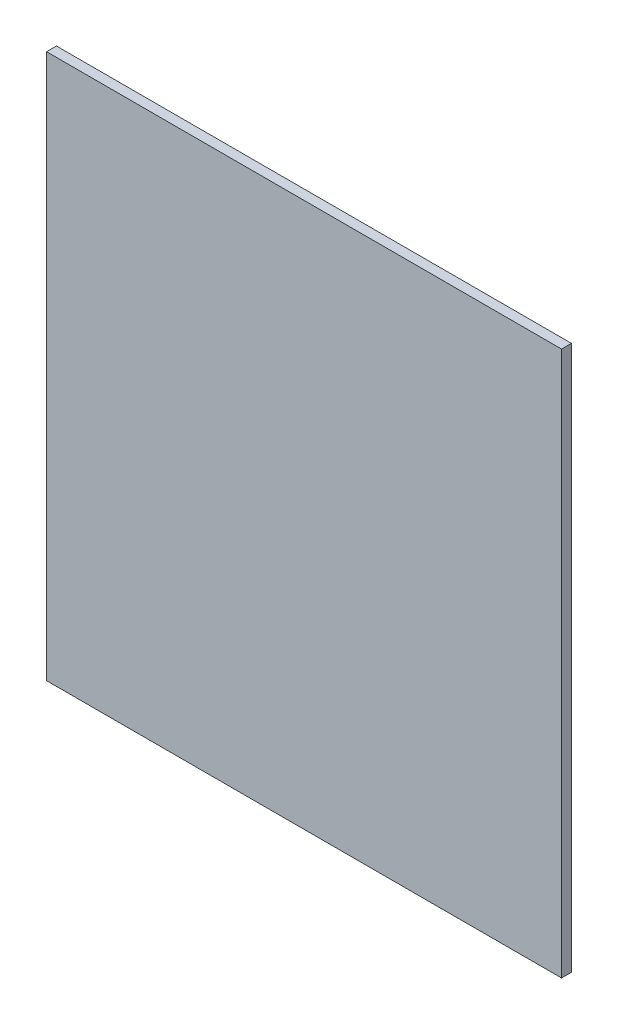
ISO-10303-21;
HEADER;
FILE_DESCRIPTION(('STEP AP214'),'2;1');
FILE_NAME('part.step','',(''),(''),'','','');
FILE_SCHEMA(('AUTOMOTIVE_DESIGN { 1 0 10303 214 1 1 1 1 }'));
ENDSEC;
DATA;
#1=APPLICATION_CONTEXT('core data for automotive mechanical design processes');
#2=APPLICATION_PROTOCOL_DEFINITION('international standard','automotive_design',2000,#1);
#3=PRODUCT_CONTEXT('',#1,'mechanical');
#4=PRODUCT('Part','Part','',(#3));
#5=PRODUCT_RELATED_PRODUCT_CATEGORY('part','',(#4));
#6=PRODUCT_DEFINITION_FORMATION('','',#4);
#7=PRODUCT_DEFINITION_CONTEXT('part definition',#1,'design');
#8=PRODUCT_DEFINITION('design','',#6,#7);
#9=PRODUCT_DEFINITION_SHAPE('','',#8);
#10=(LENGTH_UNIT() NAMED_UNIT(*) SI_UNIT(.MILLI.,.METRE.));
#11=(NAMED_UNIT(*) PLANE_ANGLE_UNIT() SI_UNIT($,.RADIAN.));
#12=(NAMED_UNIT(*) SI_UNIT($,.STERADIAN.) SOLID_ANGLE_UNIT());
#13=UNCERTAINTY_MEASURE_WITH_UNIT(LENGTH_MEASURE(1.E-05),#10,'distance_accuracy_value','');
#14=(GEOMETRIC_REPRESENTATION_CONTEXT(3) GLOBAL_UNCERTAINTY_ASSIGNED_CONTEXT((#13)) GLOBAL_UNIT_ASSIGNED_CONTEXT((#10,
#11,#12)) REPRESENTATION_CONTEXT('',''));
#15=CARTESIAN_POINT('',(0.,0.,0.));
#16=DIRECTION('',(0.,0.,1.));
#17=DIRECTION('',(1.,0.,0.));
#18=AXIS2_PLACEMENT_3D('',#15,#16,#17);
#19=CARTESIAN_POINT('',(0.,0.,6.));
#20=DIRECTION('',(-1.,0.,0.));
#21=DIRECTION('',(0.,-1.,0.));
#22=AXIS2_PLACEMENT_3D('',#19,#20,#21);
#23=PLANE('',#22);
#24=DIRECTION('',(0.,1.,0.));
#25=VECTOR('',#24,1.);
#26=CARTESIAN_POINT('',(0.,0.,0.));
#27=LINE('',#26,#25);
#28=CARTESIAN_POINT('',(0.,0.,0.));
#29=VERTEX_POINT('',#28);
#30=CARTESIAN_POINT('',(0.,330.,0.));
#31=VERTEX_POINT('',#30);
#32=EDGE_CURVE('E96',#29,#31,#27,.T.);
#33=ORIENTED_EDGE('',*,*,#32,.T.);
#34=DIRECTION('',(0.,0.,-1.));
#35=VECTOR('',#34,1.);
#36=CARTESIAN_POINT('',(0.,330.,6.));
#37=LINE('',#36,#35);
#38=CARTESIAN_POINT('',(0.,330.,6.));
#39=VERTEX_POINT('',#38);
#40=EDGE_CURVE('E11',#39,#31,#37,.T.);
#41=ORIENTED_EDGE('',*,*,#40,.F.);
#42=DIRECTION('',(0.,1.,0.));
#43=VECTOR('',#42,1.);
#44=CARTESIAN_POINT('',(0.,0.,6.));
#45=LINE('',#44,#43);
#46=CARTESIAN_POINT('',(0.,0.,6.));
#47=VERTEX_POINT('',#46);
#48=EDGE_CURVE('E84',#47,#39,#45,.T.);
#49=ORIENTED_EDGE('',*,*,#48,.F.);
#50=DIRECTION('',(0.,0.,-1.));
#51=VECTOR('',#50,1.);
#52=CARTESIAN_POINT('',(0.,0.,6.));
#53=LINE('',#52,#51);
#54=EDGE_CURVE('E92',#47,#29,#53,.T.);
#55=ORIENTED_EDGE('',*,*,#54,.T.);
#56=EDGE_LOOP('',(#33,#41,#49,#55));
#57=FACE_BOUND('',#56,.T.);
#58=ADVANCED_FACE('F33',(#57),#23,.F.);
#59=CARTESIAN_POINT('',(0.,330.,6.));
#60=DIRECTION('',(0.,-1.,0.));
#61=DIRECTION('',(0.,0.,-1.));
#62=AXIS2_PLACEMENT_3D('',#59,#60,#61);
#63=PLANE('',#62);
#64=DIRECTION('',(-1.,0.,0.));
#65=VECTOR('',#64,1.);
#66=CARTESIAN_POINT('',(0.,330.,0.));
#67=LINE('',#66,#65);
#68=CARTESIAN_POINT('',(-312.,330.,0.));
#69=VERTEX_POINT('',#68);
#70=EDGE_CURVE('E88',#31,#69,#67,.T.);
#71=ORIENTED_EDGE('',*,*,#70,.T.);
#72=DIRECTION('',(0.,0.,-1.));
#73=VECTOR('',#72,1.);
#74=CARTESIAN_POINT('',(-312.,330.,6.));
#75=LINE('',#74,#73);
#76=CARTESIAN_POINT('',(-312.,330.,6.));
#77=VERTEX_POINT('',#76);
#78=EDGE_CURVE('E41',#77,#69,#75,.T.);
#79=ORIENTED_EDGE('',*,*,#78,.F.);
#80=DIRECTION('',(-1.,0.,0.));
#81=VECTOR('',#80,1.);
#82=CARTESIAN_POINT('',(0.,330.,6.));
#83=LINE('',#82,#81);
#84=EDGE_CURVE('E79',#39,#77,#83,.T.);
#85=ORIENTED_EDGE('',*,*,#84,.F.);
#86=ORIENTED_EDGE('',*,*,#40,.T.);
#87=EDGE_LOOP('',(#71,#79,#85,#86));
#88=FACE_BOUND('',#87,.T.);
#89=ADVANCED_FACE('F87',(#88),#63,.F.);
#90=CARTESIAN_POINT('',(-312.,0.,6.));
#91=DIRECTION('',(1.,0.,0.));
#92=DIRECTION('',(0.,0.,-1.));
#93=AXIS2_PLACEMENT_3D('',#90,#91,#92);
#94=PLANE('',#93);
#95=DIRECTION('',(0.,-1.,0.));
#96=VECTOR('',#95,1.);
#97=CARTESIAN_POINT('',(-312.,0.,0.));
#98=LINE('',#97,#96);
#99=CARTESIAN_POINT('',(-312.,0.,0.));
#100=VERTEX_POINT('',#99);
#101=EDGE_CURVE('E66',#69,#100,#98,.T.);
#102=ORIENTED_EDGE('',*,*,#101,.T.);
#103=DIRECTION('',(0.,0.,-1.));
#104=VECTOR('',#103,1.);
#105=CARTESIAN_POINT('',(-312.,0.,6.));
#106=LINE('',#105,#104);
#107=CARTESIAN_POINT('',(-312.,0.,6.));
#108=VERTEX_POINT('',#107);
#109=EDGE_CURVE('E89',#108,#100,#106,.T.);
#110=ORIENTED_EDGE('',*,*,#109,.F.);
#111=DIRECTION('',(0.,-1.,0.));
#112=VECTOR('',#111,1.);
#113=CARTESIAN_POINT('',(-312.,0.,6.));
#114=LINE('',#113,#112);
#115=EDGE_CURVE('E82',#77,#108,#114,.T.);
#116=ORIENTED_EDGE('',*,*,#115,.F.);
#117=ORIENTED_EDGE('',*,*,#78,.T.);
#118=EDGE_LOOP('',(#102,#110,#116,#117));
#119=FACE_BOUND('',#118,.T.);
#120=ADVANCED_FACE('F90',(#119),#94,.F.);
#121=CARTESIAN_POINT('',(0.,0.,6.));
#122=DIRECTION('',(0.,1.,0.));
#123=DIRECTION('',(-1.,0.,0.));
#124=AXIS2_PLACEMENT_3D('',#121,#122,#123);
#125=PLANE('',#124);
#126=DIRECTION('',(1.,0.,0.));
#127=VECTOR('',#126,1.);
#128=CARTESIAN_POINT('',(0.,0.,0.));
#129=LINE('',#128,#127);
#130=EDGE_CURVE('E72',#100,#29,#129,.T.);
#131=ORIENTED_EDGE('',*,*,#130,.T.);
#132=ORIENTED_EDGE('',*,*,#54,.F.);
#133=DIRECTION('',(1.,0.,0.));
#134=VECTOR('',#133,1.);
#135=CARTESIAN_POINT('',(0.,0.,6.));
#136=LINE('',#135,#134);
#137=EDGE_CURVE('E49',#108,#47,#136,.T.);
#138=ORIENTED_EDGE('',*,*,#137,.F.);
#139=ORIENTED_EDGE('',*,*,#109,.T.);
#140=EDGE_LOOP('',(#131,#132,#138,#139));
#141=FACE_BOUND('',#140,.T.);
#142=ADVANCED_FACE('F103',(#141),#125,.F.);
#143=CARTESIAN_POINT('',(0.,0.,6.));
#144=DIRECTION('',(0.,0.,1.));
#145=DIRECTION('',(1.,0.,0.));
#146=AXIS2_PLACEMENT_3D('',#143,#144,#145);
#147=PLANE('',#146);
#148=ORIENTED_EDGE('',*,*,#48,.T.);
#149=ORIENTED_EDGE('',*,*,#84,.T.);
#150=ORIENTED_EDGE('',*,*,#115,.T.);
#151=ORIENTED_EDGE('',*,*,#137,.T.);
#152=EDGE_LOOP('',(#148,#149,#150,#151));
#153=FACE_BOUND('',#152,.T.);
#154=ADVANCED_FACE('F80',(#153),#147,.T.);
#155=CARTESIAN_POINT('',(0.,0.,0.));
#156=DIRECTION('',(0.,0.,1.));
#157=DIRECTION('',(1.,0.,0.));
#158=AXIS2_PLACEMENT_3D('',#155,#156,#157);
#159=PLANE('',#158);
#160=ORIENTED_EDGE('',*,*,#32,.F.);
#161=ORIENTED_EDGE('',*,*,#130,.F.);
#162=ORIENTED_EDGE('',*,*,#101,.F.);
#163=ORIENTED_EDGE('',*,*,#70,.F.);
#164=EDGE_LOOP('',(#160,#161,#162,#163));
#165=FACE_BOUND('',#164,.T.);
#166=ADVANCED_FACE('F106',(#165),#159,.F.);
#167=CLOSED_SHELL('',(#58,#89,#120,#142,#154,#166));
#168=MANIFOLD_SOLID_BREP('B2',#167);
#169=ADVANCED_BREP_SHAPE_REPRESENTATION('',(#18,#168),#14);
#170=SHAPE_DEFINITION_REPRESENTATION(#9,#169);
ENDSEC;
END-ISO-10303-21;
